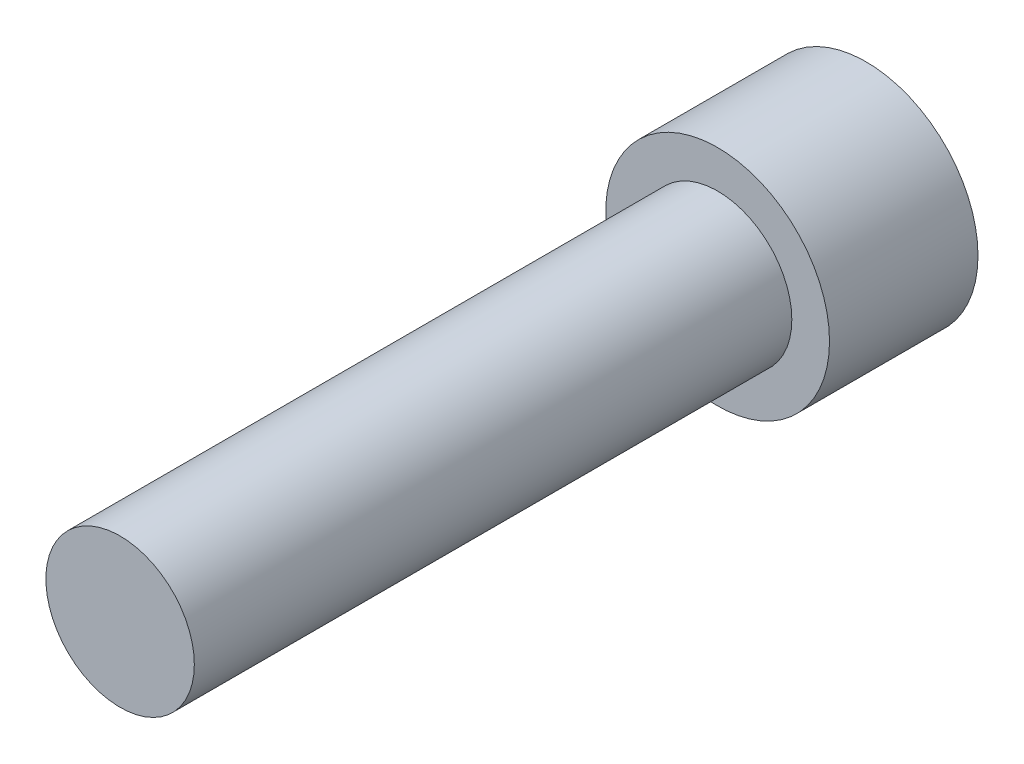
ISO-10303-21;
HEADER;
FILE_DESCRIPTION(('STEP AP214'),'2;1');
FILE_NAME('part.step','',(''),(''),'','','');
FILE_SCHEMA(('AUTOMOTIVE_DESIGN { 1 0 10303 214 1 1 1 1 }'));
ENDSEC;
DATA;
#1=APPLICATION_CONTEXT('core data for automotive mechanical design processes');
#2=APPLICATION_PROTOCOL_DEFINITION('international standard','automotive_design',2000,#1);
#3=PRODUCT_CONTEXT('',#1,'mechanical');
#4=PRODUCT('Part','Part','',(#3));
#5=PRODUCT_RELATED_PRODUCT_CATEGORY('part','',(#4));
#6=PRODUCT_DEFINITION_FORMATION('','',#4);
#7=PRODUCT_DEFINITION_CONTEXT('part definition',#1,'design');
#8=PRODUCT_DEFINITION('design','',#6,#7);
#9=PRODUCT_DEFINITION_SHAPE('','',#8);
#10=(LENGTH_UNIT() NAMED_UNIT(*) SI_UNIT(.MILLI.,.METRE.));
#11=(NAMED_UNIT(*) PLANE_ANGLE_UNIT() SI_UNIT($,.RADIAN.));
#12=(NAMED_UNIT(*) SI_UNIT($,.STERADIAN.) SOLID_ANGLE_UNIT());
#13=UNCERTAINTY_MEASURE_WITH_UNIT(LENGTH_MEASURE(1.E-05),#10,'distance_accuracy_value','');
#14=(GEOMETRIC_REPRESENTATION_CONTEXT(3) GLOBAL_UNCERTAINTY_ASSIGNED_CONTEXT((#13)) GLOBAL_UNIT_ASSIGNED_CONTEXT((#10,
#11,#12)) REPRESENTATION_CONTEXT('',''));
#15=CARTESIAN_POINT('',(0.,0.,0.));
#16=DIRECTION('',(0.,0.,1.));
#17=DIRECTION('',(1.,0.,0.));
#18=AXIS2_PLACEMENT_3D('',#15,#16,#17);
#19=CARTESIAN_POINT('',(0.,0.,7.9));
#20=DIRECTION('',(0.,0.,-1.));
#21=DIRECTION('',(-1.,0.,0.));
#22=AXIS2_PLACEMENT_3D('',#19,#20,#21);
#23=CYLINDRICAL_SURFACE('',#22,5.955);
#24=CARTESIAN_POINT('',(0.,0.,7.9));
#25=DIRECTION('',(0.,0.,1.));
#26=DIRECTION('',(1.,0.,0.));
#27=AXIS2_PLACEMENT_3D('',#24,#25,#26);
#28=CIRCLE('',#27,5.955);
#29=CARTESIAN_POINT('',(5.955,0.,7.9));
#30=VERTEX_POINT('',#29);
#31=EDGE_CURVE('E44',#30,#30,#28,.T.);
#32=ORIENTED_EDGE('',*,*,#31,.F.);
#33=EDGE_LOOP('',(#32));
#34=FACE_BOUND('',#33,.T.);
#35=CARTESIAN_POINT('',(0.,0.,0.));
#36=DIRECTION('',(0.,0.,1.));
#37=DIRECTION('',(1.,0.,0.));
#38=AXIS2_PLACEMENT_3D('',#35,#36,#37);
#39=CIRCLE('',#38,5.955);
#40=CARTESIAN_POINT('',(5.955,0.,0.));
#41=VERTEX_POINT('',#40);
#42=EDGE_CURVE('E40',#41,#41,#39,.T.);
#43=ORIENTED_EDGE('',*,*,#42,.T.);
#44=EDGE_LOOP('',(#43));
#45=FACE_BOUND('',#44,.T.);
#46=ADVANCED_FACE('F37',(#34,#45),#23,.T.);
#47=CARTESIAN_POINT('',(0.,0.,7.9));
#48=DIRECTION('',(0.,0.,1.));
#49=DIRECTION('',(1.,0.,0.));
#50=AXIS2_PLACEMENT_3D('',#47,#48,#49);
#51=PLANE('',#50);
#52=CARTESIAN_POINT('',(0.,0.,7.9));
#53=DIRECTION('',(0.,0.,1.));
#54=DIRECTION('',(1.,0.,0.));
#55=AXIS2_PLACEMENT_3D('',#52,#53,#54);
#56=CIRCLE('',#55,3.95);
#57=CARTESIAN_POINT('',(3.95,0.,7.9));
#58=VERTEX_POINT('',#57);
#59=EDGE_CURVE('E10',#58,#58,#56,.T.);
#60=ORIENTED_EDGE('',*,*,#59,.F.);
#61=EDGE_LOOP('',(#60));
#62=FACE_BOUND('',#61,.T.);
#63=ORIENTED_EDGE('',*,*,#31,.T.);
#64=EDGE_LOOP('',(#63));
#65=FACE_BOUND('',#64,.T.);
#66=ADVANCED_FACE('F61',(#62,#65),#51,.T.);
#67=CARTESIAN_POINT('',(0.,0.,0.));
#68=DIRECTION('',(0.,0.,1.));
#69=DIRECTION('',(1.,0.,0.));
#70=AXIS2_PLACEMENT_3D('',#67,#68,#69);
#71=PLANE('',#70);
#72=ORIENTED_EDGE('',*,*,#42,.F.);
#73=EDGE_LOOP('',(#72));
#74=FACE_BOUND('',#73,.T.);
#75=ADVANCED_FACE('F58',(#74),#71,.F.);
#76=CARTESIAN_POINT('',(0.,0.,39.69));
#77=DIRECTION('',(0.,0.,-1.));
#78=DIRECTION('',(-1.,0.,0.));
#79=AXIS2_PLACEMENT_3D('',#76,#77,#78);
#80=CYLINDRICAL_SURFACE('',#79,3.95);
#81=CARTESIAN_POINT('',(0.,0.,39.69));
#82=DIRECTION('',(0.,0.,1.));
#83=DIRECTION('',(1.,0.,0.));
#84=AXIS2_PLACEMENT_3D('',#81,#82,#83);
#85=CIRCLE('',#84,3.95);
#86=CARTESIAN_POINT('',(3.95,0.,39.69));
#87=VERTEX_POINT('',#86);
#88=EDGE_CURVE('E50',#87,#87,#85,.T.);
#89=ORIENTED_EDGE('',*,*,#88,.F.);
#90=EDGE_LOOP('',(#89));
#91=FACE_BOUND('',#90,.T.);
#92=ORIENTED_EDGE('',*,*,#59,.T.);
#93=EDGE_LOOP('',(#92));
#94=FACE_BOUND('',#93,.T.);
#95=ADVANCED_FACE('F60',(#91,#94),#80,.T.);
#96=CARTESIAN_POINT('',(0.,0.,39.69));
#97=DIRECTION('',(0.,0.,1.));
#98=DIRECTION('',(1.,0.,0.));
#99=AXIS2_PLACEMENT_3D('',#96,#97,#98);
#100=PLANE('',#99);
#101=ORIENTED_EDGE('',*,*,#88,.T.);
#102=EDGE_LOOP('',(#101));
#103=FACE_BOUND('',#102,.T.);
#104=ADVANCED_FACE('F67',(#103),#100,.T.);
#105=CLOSED_SHELL('',(#46,#66,#75,#95,#104));
#106=MANIFOLD_SOLID_BREP('B2',#105);
#107=ADVANCED_BREP_SHAPE_REPRESENTATION('',(#18,#106),#14);
#108=SHAPE_DEFINITION_REPRESENTATION(#9,#107);
ENDSEC;
END-ISO-10303-21;
